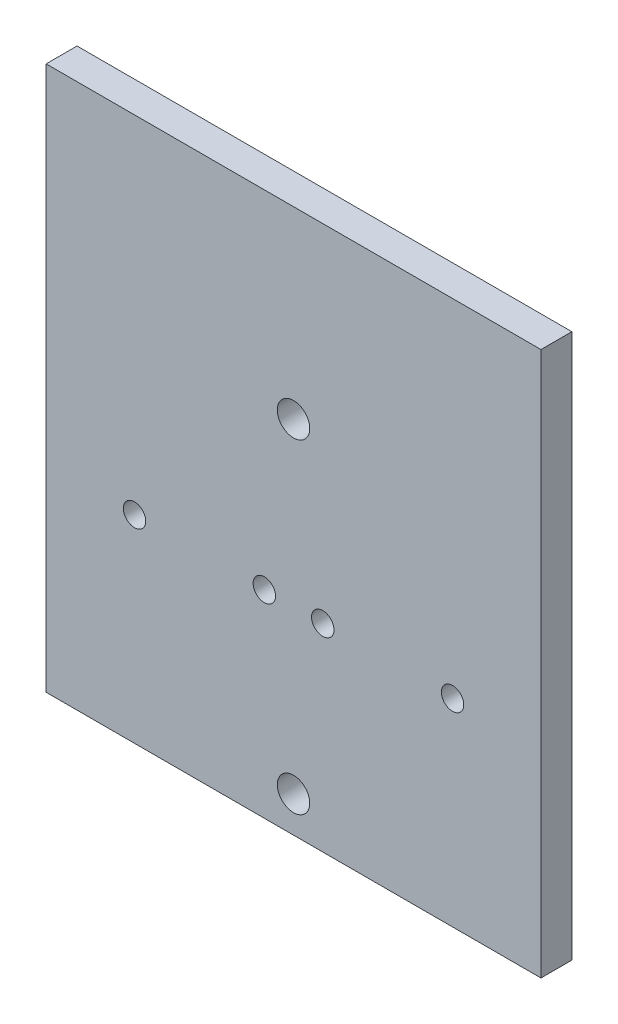
ISO-10303-21;
HEADER;
FILE_DESCRIPTION(('STEP AP214'),'2;1');
FILE_NAME('part.step','',(''),(''),'','','');
FILE_SCHEMA(('AUTOMOTIVE_DESIGN { 1 0 10303 214 1 1 1 1 }'));
ENDSEC;
DATA;
#1=APPLICATION_CONTEXT('core data for automotive mechanical design processes');
#2=APPLICATION_PROTOCOL_DEFINITION('international standard','automotive_design',2000,#1);
#3=PRODUCT_CONTEXT('',#1,'mechanical');
#4=PRODUCT('Part','Part','',(#3));
#5=PRODUCT_RELATED_PRODUCT_CATEGORY('part','',(#4));
#6=PRODUCT_DEFINITION_FORMATION('','',#4);
#7=PRODUCT_DEFINITION_CONTEXT('part definition',#1,'design');
#8=PRODUCT_DEFINITION('design','',#6,#7);
#9=PRODUCT_DEFINITION_SHAPE('','',#8);
#10=(LENGTH_UNIT() NAMED_UNIT(*) SI_UNIT(.MILLI.,.METRE.));
#11=(NAMED_UNIT(*) PLANE_ANGLE_UNIT() SI_UNIT($,.RADIAN.));
#12=(NAMED_UNIT(*) SI_UNIT($,.STERADIAN.) SOLID_ANGLE_UNIT());
#13=UNCERTAINTY_MEASURE_WITH_UNIT(LENGTH_MEASURE(1.E-05),#10,'distance_accuracy_value','');
#14=(GEOMETRIC_REPRESENTATION_CONTEXT(3) GLOBAL_UNCERTAINTY_ASSIGNED_CONTEXT((#13)) GLOBAL_UNIT_ASSIGNED_CONTEXT((#10,
#11,#12)) REPRESENTATION_CONTEXT('',''));
#15=CARTESIAN_POINT('',(0.,0.,0.));
#16=DIRECTION('',(0.,0.,1.));
#17=DIRECTION('',(1.,0.,0.));
#18=AXIS2_PLACEMENT_3D('',#15,#16,#17);
#19=CARTESIAN_POINT('',(0.,-30.5,4.7625));
#20=DIRECTION('',(0.,1.,0.));
#21=DIRECTION('',(0.,0.,1.));
#22=AXIS2_PLACEMENT_3D('',#19,#20,#21);
#23=PLANE('',#22);
#24=DIRECTION('',(1.,0.,0.));
#25=VECTOR('',#24,1.);
#26=CARTESIAN_POINT('',(0.,-30.5,0.));
#27=LINE('',#26,#25);
#28=CARTESIAN_POINT('',(-38.12,-30.5,0.));
#29=VERTEX_POINT('',#28);
#30=CARTESIAN_POINT('',(38.12,-30.5,0.));
#31=VERTEX_POINT('',#30);
#32=EDGE_CURVE('E66',#29,#31,#27,.T.);
#33=ORIENTED_EDGE('',*,*,#32,.T.);
#34=DIRECTION('',(0.,0.,-1.));
#35=VECTOR('',#34,1.);
#36=CARTESIAN_POINT('',(38.12,-30.5,4.7625));
#37=LINE('',#36,#35);
#38=CARTESIAN_POINT('',(38.12,-30.5,4.7625));
#39=VERTEX_POINT('',#38);
#40=EDGE_CURVE('E119',#39,#31,#37,.T.);
#41=ORIENTED_EDGE('',*,*,#40,.F.);
#42=DIRECTION('',(1.,0.,0.));
#43=VECTOR('',#42,1.);
#44=CARTESIAN_POINT('',(0.,-30.5,4.7625));
#45=LINE('',#44,#43);
#46=CARTESIAN_POINT('',(-38.12,-30.5,4.7625));
#47=VERTEX_POINT('',#46);
#48=EDGE_CURVE('E58',#47,#39,#45,.T.);
#49=ORIENTED_EDGE('',*,*,#48,.F.);
#50=DIRECTION('',(0.,0.,1.));
#51=VECTOR('',#50,1.);
#52=CARTESIAN_POINT('',(-38.12,-30.5,0.));
#53=LINE('',#52,#51);
#54=EDGE_CURVE('E90',#29,#47,#53,.T.);
#55=ORIENTED_EDGE('',*,*,#54,.F.);
#56=EDGE_LOOP('',(#33,#41,#49,#55));
#57=FACE_BOUND('',#56,.T.);
#58=ADVANCED_FACE('F41',(#57),#23,.F.);
#59=CARTESIAN_POINT('',(-24.5,0.,4.7625));
#60=DIRECTION('',(0.,0.,-1.));
#61=DIRECTION('',(-1.,0.,0.));
#62=AXIS2_PLACEMENT_3D('',#59,#60,#61);
#63=CYLINDRICAL_SURFACE('',#62,1.7272);
#64=CARTESIAN_POINT('',(-24.5,0.,4.7625));
#65=DIRECTION('',(0.,0.,1.));
#66=DIRECTION('',(1.,0.,0.));
#67=AXIS2_PLACEMENT_3D('',#64,#65,#66);
#68=CIRCLE('',#67,1.7272);
#69=CARTESIAN_POINT('',(-26.2272,0.,4.7625));
#70=VERTEX_POINT('',#69);
#71=EDGE_CURVE('E50',#70,#70,#68,.T.);
#72=CARTESIAN_POINT('',(-24.5,0.,0.));
#73=DIRECTION('',(0.,0.,1.));
#74=DIRECTION('',(1.,0.,0.));
#75=AXIS2_PLACEMENT_3D('',#72,#73,#74);
#76=CIRCLE('',#75,1.7272);
#77=CARTESIAN_POINT('',(-26.2272,0.,0.));
#78=VERTEX_POINT('',#77);
#79=EDGE_CURVE('E169',#78,#78,#76,.T.);
#80=CARTESIAN_POINT('',(-26.2272,0.,4.7625));
#81=CARTESIAN_POINT('',(-26.2272,0.,4.712890625));
#82=CARTESIAN_POINT('',(-26.2272,0.,4.66328125));
#83=CARTESIAN_POINT('',(-26.2272,0.,4.5640625));
#84=CARTESIAN_POINT('',(-26.2272,0.,4.514453125));
#85=CARTESIAN_POINT('',(-26.2272,0.,4.415234375));
#86=CARTESIAN_POINT('',(-26.2272,0.,4.365625));
#87=CARTESIAN_POINT('',(-26.2272,0.,4.26640625));
#88=CARTESIAN_POINT('',(-26.2272,0.,4.216796875));
#89=CARTESIAN_POINT('',(-26.2272,0.,4.117578125));
#90=CARTESIAN_POINT('',(-26.2272,0.,4.06796875));
#91=CARTESIAN_POINT('',(-26.2272,0.,3.96875));
#92=CARTESIAN_POINT('',(-26.2272,0.,3.919140625));
#93=CARTESIAN_POINT('',(-26.2272,0.,3.819921875));
#94=CARTESIAN_POINT('',(-26.2272,0.,3.7703125));
#95=CARTESIAN_POINT('',(-26.2272,0.,3.67109375));
#96=CARTESIAN_POINT('',(-26.2272,0.,3.621484375));
#97=CARTESIAN_POINT('',(-26.2272,0.,3.522265625));
#98=CARTESIAN_POINT('',(-26.2272,0.,3.47265625));
#99=CARTESIAN_POINT('',(-26.2272,0.,3.3734375));
#100=CARTESIAN_POINT('',(-26.2272,0.,3.323828125));
#101=CARTESIAN_POINT('',(-26.2272,0.,3.224609375));
#102=CARTESIAN_POINT('',(-26.2272,0.,3.175));
#103=CARTESIAN_POINT('',(-26.2272,0.,3.07578125));
#104=CARTESIAN_POINT('',(-26.2272,0.,3.026171875));
#105=CARTESIAN_POINT('',(-26.2272,0.,2.926953125));
#106=CARTESIAN_POINT('',(-26.2272,0.,2.87734375));
#107=CARTESIAN_POINT('',(-26.2272,0.,2.778125));
#108=CARTESIAN_POINT('',(-26.2272,0.,2.728515625));
#109=CARTESIAN_POINT('',(-26.2272,0.,2.629296875));
#110=CARTESIAN_POINT('',(-26.2272,0.,2.5796875));
#111=CARTESIAN_POINT('',(-26.2272,0.,2.48046875));
#112=CARTESIAN_POINT('',(-26.2272,0.,2.430859375));
#113=CARTESIAN_POINT('',(-26.2272,0.,2.331640625));
#114=CARTESIAN_POINT('',(-26.2272,0.,2.28203125));
#115=CARTESIAN_POINT('',(-26.2272,0.,2.1828125));
#116=CARTESIAN_POINT('',(-26.2272,0.,2.133203125));
#117=CARTESIAN_POINT('',(-26.2272,0.,2.033984375));
#118=CARTESIAN_POINT('',(-26.2272,0.,1.984375));
#119=CARTESIAN_POINT('',(-26.2272,0.,1.88515625));
#120=CARTESIAN_POINT('',(-26.2272,0.,1.835546875));
#121=CARTESIAN_POINT('',(-26.2272,0.,1.736328125));
#122=CARTESIAN_POINT('',(-26.2272,0.,1.68671875));
#123=CARTESIAN_POINT('',(-26.2272,0.,1.5875));
#124=CARTESIAN_POINT('',(-26.2272,0.,1.537890625));
#125=CARTESIAN_POINT('',(-26.2272,0.,1.438671875));
#126=CARTESIAN_POINT('',(-26.2272,0.,1.3890625));
#127=CARTESIAN_POINT('',(-26.2272,0.,1.28984375));
#128=CARTESIAN_POINT('',(-26.2272,0.,1.240234375));
#129=CARTESIAN_POINT('',(-26.2272,0.,1.141015625));
#130=CARTESIAN_POINT('',(-26.2272,0.,1.09140625));
#131=CARTESIAN_POINT('',(-26.2272,0.,0.992187499999999));
#132=CARTESIAN_POINT('',(-26.2272,0.,0.942578124999999));
#133=CARTESIAN_POINT('',(-26.2272,0.,0.843359375));
#134=CARTESIAN_POINT('',(-26.2272,0.,0.79375));
#135=CARTESIAN_POINT('',(-26.2272,0.,0.69453125));
#136=CARTESIAN_POINT('',(-26.2272,0.,0.644921875));
#137=CARTESIAN_POINT('',(-26.2272,0.,0.545703125));
#138=CARTESIAN_POINT('',(-26.2272,0.,0.49609375));
#139=CARTESIAN_POINT('',(-26.2272,0.,0.396875));
#140=CARTESIAN_POINT('',(-26.2272,0.,0.347265625));
#141=CARTESIAN_POINT('',(-26.2272,0.,0.248046875));
#142=CARTESIAN_POINT('',(-26.2272,0.,0.1984375));
#143=CARTESIAN_POINT('',(-26.2272,0.,0.09921875));
#144=CARTESIAN_POINT('',(-26.2272,0.,0.049609375));
#145=CARTESIAN_POINT('',(-26.2272,0.,0.));
#146=B_SPLINE_CURVE_WITH_KNOTS('',3,(#80,#81,#82,#83,#84,#85,#86,#87,#88,#89,#90,#91,#92,#93,
#94,#95,#96,#97,#98,#99,#100,#101,#102,#103,#104,#105,#106,#107,#108,#109,#110,#111,#112,#113,
#114,#115,#116,#117,#118,#119,#120,#121,#122,#123,#124,#125,#126,#127,#128,#129,#130,#131,#132,
#133,#134,#135,#136,#137,#138,#139,#140,#141,#142,#143,#144,#145),.UNSPECIFIED.,.F.,.F.,(4,2,2,
2,2,2,2,2,2,2,2,2,2,2,2,2,2,2,2,2,2,2,2,2,2,2,2,2,2,2,2,2,4),(0.,0.148828125,0.29765625,
0.446484375,0.5953125,0.744140625,0.892968750000001,1.041796875,1.190625,1.339453125,1.48828125,
1.637109375,1.7859375,1.934765625,2.08359375,2.232421875,2.38125,2.530078125,2.67890625,
2.827734375,2.9765625,3.125390625,3.27421875,3.423046875,3.571875,3.720703125,3.86953125,
4.018359375,4.1671875,4.316015625,4.46484375,4.613671875,4.7625),.UNSPECIFIED.);
#147=EDGE_CURVE('BSEAM195',#70,#78,#146,.T.);
#148=ORIENTED_EDGE('',*,*,#71,.T.);
#149=ORIENTED_EDGE('',*,*,#79,.F.);
#150=ORIENTED_EDGE('',*,*,#147,.T.);
#151=ORIENTED_EDGE('',*,*,#147,.F.);
#152=EDGE_LOOP('',(#148,#150,#149,#151));
#153=FACE_BOUND('',#152,.T.);
#154=ADVANCED_FACE('F195',(#153),#63,.F.);
#155=CARTESIAN_POINT('',(-4.5,0.,4.7625));
#156=DIRECTION('',(0.,0.,-1.));
#157=DIRECTION('',(-1.,0.,0.));
#158=AXIS2_PLACEMENT_3D('',#155,#156,#157);
#159=CYLINDRICAL_SURFACE('',#158,1.7272);
#160=CARTESIAN_POINT('',(-4.5,0.,4.7625));
#161=DIRECTION('',(0.,0.,1.));
#162=DIRECTION('',(1.,0.,0.));
#163=AXIS2_PLACEMENT_3D('',#160,#161,#162);
#164=CIRCLE('',#163,1.7272);
#165=CARTESIAN_POINT('',(-6.2272,0.,4.7625));
#166=VERTEX_POINT('',#165);
#167=EDGE_CURVE('E145',#166,#166,#164,.T.);
#168=CARTESIAN_POINT('',(-4.5,0.,0.));
#169=DIRECTION('',(0.,0.,1.));
#170=DIRECTION('',(1.,0.,0.));
#171=AXIS2_PLACEMENT_3D('',#168,#169,#170);
#172=CIRCLE('',#171,1.7272);
#173=CARTESIAN_POINT('',(-6.2272,0.,0.));
#174=VERTEX_POINT('',#173);
#175=EDGE_CURVE('E166',#174,#174,#172,.T.);
#176=CARTESIAN_POINT('',(-6.2272,0.,4.7625));
#177=CARTESIAN_POINT('',(-6.2272,0.,4.712890625));
#178=CARTESIAN_POINT('',(-6.2272,0.,4.66328125));
#179=CARTESIAN_POINT('',(-6.2272,0.,4.5640625));
#180=CARTESIAN_POINT('',(-6.2272,0.,4.514453125));
#181=CARTESIAN_POINT('',(-6.2272,0.,4.415234375));
#182=CARTESIAN_POINT('',(-6.2272,0.,4.365625));
#183=CARTESIAN_POINT('',(-6.2272,0.,4.26640625));
#184=CARTESIAN_POINT('',(-6.2272,0.,4.216796875));
#185=CARTESIAN_POINT('',(-6.2272,0.,4.117578125));
#186=CARTESIAN_POINT('',(-6.2272,0.,4.06796875));
#187=CARTESIAN_POINT('',(-6.2272,0.,3.96875));
#188=CARTESIAN_POINT('',(-6.2272,0.,3.919140625));
#189=CARTESIAN_POINT('',(-6.2272,0.,3.819921875));
#190=CARTESIAN_POINT('',(-6.2272,0.,3.7703125));
#191=CARTESIAN_POINT('',(-6.2272,0.,3.67109375));
#192=CARTESIAN_POINT('',(-6.2272,0.,3.621484375));
#193=CARTESIAN_POINT('',(-6.2272,0.,3.522265625));
#194=CARTESIAN_POINT('',(-6.2272,0.,3.47265625));
#195=CARTESIAN_POINT('',(-6.2272,0.,3.3734375));
#196=CARTESIAN_POINT('',(-6.2272,0.,3.323828125));
#197=CARTESIAN_POINT('',(-6.2272,0.,3.224609375));
#198=CARTESIAN_POINT('',(-6.2272,0.,3.175));
#199=CARTESIAN_POINT('',(-6.2272,0.,3.07578125));
#200=CARTESIAN_POINT('',(-6.2272,0.,3.026171875));
#201=CARTESIAN_POINT('',(-6.2272,0.,2.926953125));
#202=CARTESIAN_POINT('',(-6.2272,0.,2.87734375));
#203=CARTESIAN_POINT('',(-6.2272,0.,2.778125));
#204=CARTESIAN_POINT('',(-6.2272,0.,2.728515625));
#205=CARTESIAN_POINT('',(-6.2272,0.,2.629296875));
#206=CARTESIAN_POINT('',(-6.2272,0.,2.5796875));
#207=CARTESIAN_POINT('',(-6.2272,0.,2.48046875));
#208=CARTESIAN_POINT('',(-6.2272,0.,2.430859375));
#209=CARTESIAN_POINT('',(-6.2272,0.,2.331640625));
#210=CARTESIAN_POINT('',(-6.2272,0.,2.28203125));
#211=CARTESIAN_POINT('',(-6.2272,0.,2.1828125));
#212=CARTESIAN_POINT('',(-6.2272,0.,2.133203125));
#213=CARTESIAN_POINT('',(-6.2272,0.,2.033984375));
#214=CARTESIAN_POINT('',(-6.2272,0.,1.984375));
#215=CARTESIAN_POINT('',(-6.2272,0.,1.88515625));
#216=CARTESIAN_POINT('',(-6.2272,0.,1.835546875));
#217=CARTESIAN_POINT('',(-6.2272,0.,1.736328125));
#218=CARTESIAN_POINT('',(-6.2272,0.,1.68671875));
#219=CARTESIAN_POINT('',(-6.2272,0.,1.5875));
#220=CARTESIAN_POINT('',(-6.2272,0.,1.537890625));
#221=CARTESIAN_POINT('',(-6.2272,0.,1.438671875));
#222=CARTESIAN_POINT('',(-6.2272,0.,1.3890625));
#223=CARTESIAN_POINT('',(-6.2272,0.,1.28984375));
#224=CARTESIAN_POINT('',(-6.2272,0.,1.240234375));
#225=CARTESIAN_POINT('',(-6.2272,0.,1.141015625));
#226=CARTESIAN_POINT('',(-6.2272,0.,1.09140625));
#227=CARTESIAN_POINT('',(-6.2272,0.,0.992187499999999));
#228=CARTESIAN_POINT('',(-6.2272,0.,0.942578124999999));
#229=CARTESIAN_POINT('',(-6.2272,0.,0.843359375));
#230=CARTESIAN_POINT('',(-6.2272,0.,0.79375));
#231=CARTESIAN_POINT('',(-6.2272,0.,0.69453125));
#232=CARTESIAN_POINT('',(-6.2272,0.,0.644921875));
#233=CARTESIAN_POINT('',(-6.2272,0.,0.545703125));
#234=CARTESIAN_POINT('',(-6.2272,0.,0.49609375));
#235=CARTESIAN_POINT('',(-6.2272,0.,0.396875));
#236=CARTESIAN_POINT('',(-6.2272,0.,0.347265625));
#237=CARTESIAN_POINT('',(-6.2272,0.,0.248046875));
#238=CARTESIAN_POINT('',(-6.2272,0.,0.1984375));
#239=CARTESIAN_POINT('',(-6.2272,0.,0.09921875));
#240=CARTESIAN_POINT('',(-6.2272,0.,0.049609375));
#241=CARTESIAN_POINT('',(-6.2272,0.,0.));
#242=B_SPLINE_CURVE_WITH_KNOTS('',3,(#176,#177,#178,#179,#180,#181,#182,#183,#184,#185,#186,
#187,#188,#189,#190,#191,#192,#193,#194,#195,#196,#197,#198,#199,#200,#201,#202,#203,#204,#205,
#206,#207,#208,#209,#210,#211,#212,#213,#214,#215,#216,#217,#218,#219,#220,#221,#222,#223,#224,
#225,#226,#227,#228,#229,#230,#231,#232,#233,#234,#235,#236,#237,#238,#239,#240,#241),
.UNSPECIFIED.,.F.,.F.,(4,2,2,2,2,2,2,2,2,2,2,2,2,2,2,2,2,2,2,2,2,2,2,2,2,2,2,2,2,2,2,2,4),(0.,
0.148828125,0.29765625,0.446484375,0.5953125,0.744140625,0.892968750000001,1.041796875,1.190625,
1.339453125,1.48828125,1.637109375,1.7859375,1.934765625,2.08359375,2.232421875,2.38125,
2.530078125,2.67890625,2.827734375,2.9765625,3.125390625,3.27421875,3.423046875,3.571875,
3.720703125,3.86953125,4.018359375,4.1671875,4.316015625,4.46484375,4.613671875,4.7625),.UNSPECIFIED.);
#243=EDGE_CURVE('BSEAM199',#166,#174,#242,.T.);
#244=ORIENTED_EDGE('',*,*,#167,.T.);
#245=ORIENTED_EDGE('',*,*,#175,.F.);
#246=ORIENTED_EDGE('',*,*,#243,.T.);
#247=ORIENTED_EDGE('',*,*,#243,.F.);
#248=EDGE_LOOP('',(#244,#246,#245,#247));
#249=FACE_BOUND('',#248,.T.);
#250=ADVANCED_FACE('F199',(#249),#159,.F.);
#251=CARTESIAN_POINT('',(4.5,0.,4.7625));
#252=DIRECTION('',(0.,0.,-1.));
#253=DIRECTION('',(-1.,0.,0.));
#254=AXIS2_PLACEMENT_3D('',#251,#252,#253);
#255=CYLINDRICAL_SURFACE('',#254,1.7272);
#256=CARTESIAN_POINT('',(4.5,0.,4.7625));
#257=DIRECTION('',(0.,0.,1.));
#258=DIRECTION('',(1.,0.,0.));
#259=AXIS2_PLACEMENT_3D('',#256,#257,#258);
#260=CIRCLE('',#259,1.7272);
#261=CARTESIAN_POINT('',(2.7728,0.,4.7625));
#262=VERTEX_POINT('',#261);
#263=EDGE_CURVE('E141',#262,#262,#260,.T.);
#264=CARTESIAN_POINT('',(4.5,0.,0.));
#265=DIRECTION('',(0.,0.,1.));
#266=DIRECTION('',(1.,0.,0.));
#267=AXIS2_PLACEMENT_3D('',#264,#265,#266);
#268=CIRCLE('',#267,1.7272);
#269=CARTESIAN_POINT('',(2.7728,0.,0.));
#270=VERTEX_POINT('',#269);
#271=EDGE_CURVE('E162',#270,#270,#268,.T.);
#272=CARTESIAN_POINT('',(2.7728,0.,4.7625));
#273=CARTESIAN_POINT('',(2.7728,0.,4.712890625));
#274=CARTESIAN_POINT('',(2.7728,0.,4.66328125));
#275=CARTESIAN_POINT('',(2.7728,0.,4.5640625));
#276=CARTESIAN_POINT('',(2.7728,0.,4.514453125));
#277=CARTESIAN_POINT('',(2.7728,0.,4.415234375));
#278=CARTESIAN_POINT('',(2.7728,0.,4.365625));
#279=CARTESIAN_POINT('',(2.7728,0.,4.26640625));
#280=CARTESIAN_POINT('',(2.7728,0.,4.216796875));
#281=CARTESIAN_POINT('',(2.7728,0.,4.117578125));
#282=CARTESIAN_POINT('',(2.7728,0.,4.06796875));
#283=CARTESIAN_POINT('',(2.7728,0.,3.96875));
#284=CARTESIAN_POINT('',(2.7728,0.,3.919140625));
#285=CARTESIAN_POINT('',(2.7728,0.,3.819921875));
#286=CARTESIAN_POINT('',(2.7728,0.,3.7703125));
#287=CARTESIAN_POINT('',(2.7728,0.,3.67109375));
#288=CARTESIAN_POINT('',(2.7728,0.,3.621484375));
#289=CARTESIAN_POINT('',(2.7728,0.,3.522265625));
#290=CARTESIAN_POINT('',(2.7728,0.,3.47265625));
#291=CARTESIAN_POINT('',(2.7728,0.,3.3734375));
#292=CARTESIAN_POINT('',(2.7728,0.,3.323828125));
#293=CARTESIAN_POINT('',(2.7728,0.,3.224609375));
#294=CARTESIAN_POINT('',(2.7728,0.,3.175));
#295=CARTESIAN_POINT('',(2.7728,0.,3.07578125));
#296=CARTESIAN_POINT('',(2.7728,0.,3.026171875));
#297=CARTESIAN_POINT('',(2.7728,0.,2.926953125));
#298=CARTESIAN_POINT('',(2.7728,0.,2.87734375));
#299=CARTESIAN_POINT('',(2.7728,0.,2.778125));
#300=CARTESIAN_POINT('',(2.7728,0.,2.728515625));
#301=CARTESIAN_POINT('',(2.7728,0.,2.629296875));
#302=CARTESIAN_POINT('',(2.7728,0.,2.5796875));
#303=CARTESIAN_POINT('',(2.7728,0.,2.48046875));
#304=CARTESIAN_POINT('',(2.7728,0.,2.430859375));
#305=CARTESIAN_POINT('',(2.7728,0.,2.331640625));
#306=CARTESIAN_POINT('',(2.7728,0.,2.28203125));
#307=CARTESIAN_POINT('',(2.7728,0.,2.1828125));
#308=CARTESIAN_POINT('',(2.7728,0.,2.133203125));
#309=CARTESIAN_POINT('',(2.7728,0.,2.033984375));
#310=CARTESIAN_POINT('',(2.7728,0.,1.984375));
#311=CARTESIAN_POINT('',(2.7728,0.,1.88515625));
#312=CARTESIAN_POINT('',(2.7728,0.,1.835546875));
#313=CARTESIAN_POINT('',(2.7728,0.,1.736328125));
#314=CARTESIAN_POINT('',(2.7728,0.,1.68671875));
#315=CARTESIAN_POINT('',(2.7728,0.,1.5875));
#316=CARTESIAN_POINT('',(2.7728,0.,1.537890625));
#317=CARTESIAN_POINT('',(2.7728,0.,1.438671875));
#318=CARTESIAN_POINT('',(2.7728,0.,1.3890625));
#319=CARTESIAN_POINT('',(2.7728,0.,1.28984375));
#320=CARTESIAN_POINT('',(2.7728,0.,1.240234375));
#321=CARTESIAN_POINT('',(2.7728,0.,1.141015625));
#322=CARTESIAN_POINT('',(2.7728,0.,1.09140625));
#323=CARTESIAN_POINT('',(2.7728,0.,0.992187499999999));
#324=CARTESIAN_POINT('',(2.7728,0.,0.942578124999999));
#325=CARTESIAN_POINT('',(2.7728,0.,0.843359375));
#326=CARTESIAN_POINT('',(2.7728,0.,0.79375));
#327=CARTESIAN_POINT('',(2.7728,0.,0.69453125));
#328=CARTESIAN_POINT('',(2.7728,0.,0.644921875));
#329=CARTESIAN_POINT('',(2.7728,0.,0.545703125));
#330=CARTESIAN_POINT('',(2.7728,0.,0.49609375));
#331=CARTESIAN_POINT('',(2.7728,0.,0.396875));
#332=CARTESIAN_POINT('',(2.7728,0.,0.347265625));
#333=CARTESIAN_POINT('',(2.7728,0.,0.248046875));
#334=CARTESIAN_POINT('',(2.7728,0.,0.1984375));
#335=CARTESIAN_POINT('',(2.7728,0.,0.09921875));
#336=CARTESIAN_POINT('',(2.7728,0.,0.049609375));
#337=CARTESIAN_POINT('',(2.7728,0.,0.));
#338=B_SPLINE_CURVE_WITH_KNOTS('',3,(#272,#273,#274,#275,#276,#277,#278,#279,#280,#281,#282,
#283,#284,#285,#286,#287,#288,#289,#290,#291,#292,#293,#294,#295,#296,#297,#298,#299,#300,#301,
#302,#303,#304,#305,#306,#307,#308,#309,#310,#311,#312,#313,#314,#315,#316,#317,#318,#319,#320,
#321,#322,#323,#324,#325,#326,#327,#328,#329,#330,#331,#332,#333,#334,#335,#336,#337),
.UNSPECIFIED.,.F.,.F.,(4,2,2,2,2,2,2,2,2,2,2,2,2,2,2,2,2,2,2,2,2,2,2,2,2,2,2,2,2,2,2,2,4),(0.,
0.148828125,0.29765625,0.446484375,0.5953125,0.744140625,0.892968750000001,1.041796875,1.190625,
1.339453125,1.48828125,1.637109375,1.7859375,1.934765625,2.08359375,2.232421875,2.38125,
2.530078125,2.67890625,2.827734375,2.9765625,3.125390625,3.27421875,3.423046875,3.571875,
3.720703125,3.86953125,4.018359375,4.1671875,4.316015625,4.46484375,4.613671875,4.7625),.UNSPECIFIED.);
#339=EDGE_CURVE('BSEAM214',#262,#270,#338,.T.);
#340=ORIENTED_EDGE('',*,*,#263,.T.);
#341=ORIENTED_EDGE('',*,*,#271,.F.);
#342=ORIENTED_EDGE('',*,*,#339,.T.);
#343=ORIENTED_EDGE('',*,*,#339,.F.);
#344=EDGE_LOOP('',(#340,#342,#341,#343));
#345=FACE_BOUND('',#344,.T.);
#346=ADVANCED_FACE('F214',(#345),#255,.F.);
#347=CARTESIAN_POINT('',(24.5,0.,4.7625));
#348=DIRECTION('',(0.,0.,-1.));
#349=DIRECTION('',(-1.,0.,0.));
#350=AXIS2_PLACEMENT_3D('',#347,#348,#349);
#351=CYLINDRICAL_SURFACE('',#350,1.7272);
#352=CARTESIAN_POINT('',(24.5,0.,4.7625));
#353=DIRECTION('',(0.,0.,1.));
#354=DIRECTION('',(1.,0.,0.));
#355=AXIS2_PLACEMENT_3D('',#352,#353,#354);
#356=CIRCLE('',#355,1.7272);
#357=CARTESIAN_POINT('',(22.7728,0.,4.7625));
#358=VERTEX_POINT('',#357);
#359=EDGE_CURVE('E137',#358,#358,#356,.T.);
#360=CARTESIAN_POINT('',(24.5,0.,0.));
#361=DIRECTION('',(0.,0.,1.));
#362=DIRECTION('',(1.,0.,0.));
#363=AXIS2_PLACEMENT_3D('',#360,#361,#362);
#364=CIRCLE('',#363,1.7272);
#365=CARTESIAN_POINT('',(22.7728,0.,0.));
#366=VERTEX_POINT('',#365);
#367=EDGE_CURVE('E158',#366,#366,#364,.T.);
#368=CARTESIAN_POINT('',(22.7728,0.,4.7625));
#369=CARTESIAN_POINT('',(22.7728,0.,4.712890625));
#370=CARTESIAN_POINT('',(22.7728,0.,4.66328125));
#371=CARTESIAN_POINT('',(22.7728,0.,4.5640625));
#372=CARTESIAN_POINT('',(22.7728,0.,4.514453125));
#373=CARTESIAN_POINT('',(22.7728,0.,4.415234375));
#374=CARTESIAN_POINT('',(22.7728,0.,4.365625));
#375=CARTESIAN_POINT('',(22.7728,0.,4.26640625));
#376=CARTESIAN_POINT('',(22.7728,0.,4.216796875));
#377=CARTESIAN_POINT('',(22.7728,0.,4.117578125));
#378=CARTESIAN_POINT('',(22.7728,0.,4.06796875));
#379=CARTESIAN_POINT('',(22.7728,0.,3.96875));
#380=CARTESIAN_POINT('',(22.7728,0.,3.919140625));
#381=CARTESIAN_POINT('',(22.7728,0.,3.819921875));
#382=CARTESIAN_POINT('',(22.7728,0.,3.7703125));
#383=CARTESIAN_POINT('',(22.7728,0.,3.67109375));
#384=CARTESIAN_POINT('',(22.7728,0.,3.621484375));
#385=CARTESIAN_POINT('',(22.7728,0.,3.522265625));
#386=CARTESIAN_POINT('',(22.7728,0.,3.47265625));
#387=CARTESIAN_POINT('',(22.7728,0.,3.3734375));
#388=CARTESIAN_POINT('',(22.7728,0.,3.323828125));
#389=CARTESIAN_POINT('',(22.7728,0.,3.224609375));
#390=CARTESIAN_POINT('',(22.7728,0.,3.175));
#391=CARTESIAN_POINT('',(22.7728,0.,3.07578125));
#392=CARTESIAN_POINT('',(22.7728,0.,3.026171875));
#393=CARTESIAN_POINT('',(22.7728,0.,2.926953125));
#394=CARTESIAN_POINT('',(22.7728,0.,2.87734375));
#395=CARTESIAN_POINT('',(22.7728,0.,2.778125));
#396=CARTESIAN_POINT('',(22.7728,0.,2.728515625));
#397=CARTESIAN_POINT('',(22.7728,0.,2.629296875));
#398=CARTESIAN_POINT('',(22.7728,0.,2.5796875));
#399=CARTESIAN_POINT('',(22.7728,0.,2.48046875));
#400=CARTESIAN_POINT('',(22.7728,0.,2.430859375));
#401=CARTESIAN_POINT('',(22.7728,0.,2.331640625));
#402=CARTESIAN_POINT('',(22.7728,0.,2.28203125));
#403=CARTESIAN_POINT('',(22.7728,0.,2.1828125));
#404=CARTESIAN_POINT('',(22.7728,0.,2.133203125));
#405=CARTESIAN_POINT('',(22.7728,0.,2.033984375));
#406=CARTESIAN_POINT('',(22.7728,0.,1.984375));
#407=CARTESIAN_POINT('',(22.7728,0.,1.88515625));
#408=CARTESIAN_POINT('',(22.7728,0.,1.835546875));
#409=CARTESIAN_POINT('',(22.7728,0.,1.736328125));
#410=CARTESIAN_POINT('',(22.7728,0.,1.68671875));
#411=CARTESIAN_POINT('',(22.7728,0.,1.5875));
#412=CARTESIAN_POINT('',(22.7728,0.,1.537890625));
#413=CARTESIAN_POINT('',(22.7728,0.,1.438671875));
#414=CARTESIAN_POINT('',(22.7728,0.,1.3890625));
#415=CARTESIAN_POINT('',(22.7728,0.,1.28984375));
#416=CARTESIAN_POINT('',(22.7728,0.,1.240234375));
#417=CARTESIAN_POINT('',(22.7728,0.,1.141015625));
#418=CARTESIAN_POINT('',(22.7728,0.,1.09140625));
#419=CARTESIAN_POINT('',(22.7728,0.,0.992187499999999));
#420=CARTESIAN_POINT('',(22.7728,0.,0.942578124999999));
#421=CARTESIAN_POINT('',(22.7728,0.,0.843359375));
#422=CARTESIAN_POINT('',(22.7728,0.,0.79375));
#423=CARTESIAN_POINT('',(22.7728,0.,0.69453125));
#424=CARTESIAN_POINT('',(22.7728,0.,0.644921875));
#425=CARTESIAN_POINT('',(22.7728,0.,0.545703125));
#426=CARTESIAN_POINT('',(22.7728,0.,0.49609375));
#427=CARTESIAN_POINT('',(22.7728,0.,0.396875));
#428=CARTESIAN_POINT('',(22.7728,0.,0.347265625));
#429=CARTESIAN_POINT('',(22.7728,0.,0.248046875));
#430=CARTESIAN_POINT('',(22.7728,0.,0.1984375));
#431=CARTESIAN_POINT('',(22.7728,0.,0.09921875));
#432=CARTESIAN_POINT('',(22.7728,0.,0.049609375));
#433=CARTESIAN_POINT('',(22.7728,0.,0.));
#434=B_SPLINE_CURVE_WITH_KNOTS('',3,(#368,#369,#370,#371,#372,#373,#374,#375,#376,#377,#378,
#379,#380,#381,#382,#383,#384,#385,#386,#387,#388,#389,#390,#391,#392,#393,#394,#395,#396,#397,
#398,#399,#400,#401,#402,#403,#404,#405,#406,#407,#408,#409,#410,#411,#412,#413,#414,#415,#416,
#417,#418,#419,#420,#421,#422,#423,#424,#425,#426,#427,#428,#429,#430,#431,#432,#433),
.UNSPECIFIED.,.F.,.F.,(4,2,2,2,2,2,2,2,2,2,2,2,2,2,2,2,2,2,2,2,2,2,2,2,2,2,2,2,2,2,2,2,4),(0.,
0.148828125,0.29765625,0.446484375,0.5953125,0.744140625,0.892968750000001,1.041796875,1.190625,
1.339453125,1.48828125,1.637109375,1.7859375,1.934765625,2.08359375,2.232421875,2.38125,
2.530078125,2.67890625,2.827734375,2.9765625,3.125390625,3.27421875,3.423046875,3.571875,
3.720703125,3.86953125,4.018359375,4.1671875,4.316015625,4.46484375,4.613671875,4.7625),.UNSPECIFIED.);
#435=EDGE_CURVE('BSEAM190',#358,#366,#434,.T.);
#436=ORIENTED_EDGE('',*,*,#359,.T.);
#437=ORIENTED_EDGE('',*,*,#367,.F.);
#438=ORIENTED_EDGE('',*,*,#435,.T.);
#439=ORIENTED_EDGE('',*,*,#435,.F.);
#440=EDGE_LOOP('',(#436,#438,#437,#439));
#441=FACE_BOUND('',#440,.T.);
#442=ADVANCED_FACE('F190',(#441),#351,.F.);
#443=CARTESIAN_POINT('',(0.,-25.,4.7625));
#444=DIRECTION('',(0.,0.,-1.));
#445=DIRECTION('',(-1.,0.,0.));
#446=AXIS2_PLACEMENT_3D('',#443,#444,#445);
#447=CYLINDRICAL_SURFACE('',#446,2.5);
#448=CARTESIAN_POINT('',(0.,-25.,4.7625));
#449=DIRECTION('',(0.,0.,1.));
#450=DIRECTION('',(1.,0.,0.));
#451=AXIS2_PLACEMENT_3D('',#448,#449,#450);
#452=CIRCLE('',#451,2.5);
#453=CARTESIAN_POINT('',(-2.5,-25.,4.7625));
#454=VERTEX_POINT('',#453);
#455=EDGE_CURVE('E133',#454,#454,#452,.T.);
#456=CARTESIAN_POINT('',(0.,-25.,0.));
#457=DIRECTION('',(0.,0.,1.));
#458=DIRECTION('',(1.,0.,0.));
#459=AXIS2_PLACEMENT_3D('',#456,#457,#458);
#460=CIRCLE('',#459,2.5);
#461=CARTESIAN_POINT('',(-2.5,-25.,0.));
#462=VERTEX_POINT('',#461);
#463=EDGE_CURVE('E154',#462,#462,#460,.T.);
#464=CARTESIAN_POINT('',(-2.5,-25.,4.7625));
#465=CARTESIAN_POINT('',(-2.5,-25.,4.712890625));
#466=CARTESIAN_POINT('',(-2.5,-25.,4.66328125));
#467=CARTESIAN_POINT('',(-2.5,-25.,4.5640625));
#468=CARTESIAN_POINT('',(-2.5,-25.,4.514453125));
#469=CARTESIAN_POINT('',(-2.5,-25.,4.415234375));
#470=CARTESIAN_POINT('',(-2.5,-25.,4.365625));
#471=CARTESIAN_POINT('',(-2.5,-25.,4.26640625));
#472=CARTESIAN_POINT('',(-2.5,-25.,4.216796875));
#473=CARTESIAN_POINT('',(-2.5,-25.,4.117578125));
#474=CARTESIAN_POINT('',(-2.5,-25.,4.06796875));
#475=CARTESIAN_POINT('',(-2.5,-25.,3.96875));
#476=CARTESIAN_POINT('',(-2.5,-25.,3.919140625));
#477=CARTESIAN_POINT('',(-2.5,-25.,3.819921875));
#478=CARTESIAN_POINT('',(-2.5,-25.,3.7703125));
#479=CARTESIAN_POINT('',(-2.5,-25.,3.67109375));
#480=CARTESIAN_POINT('',(-2.5,-25.,3.621484375));
#481=CARTESIAN_POINT('',(-2.5,-25.,3.522265625));
#482=CARTESIAN_POINT('',(-2.5,-25.,3.47265625));
#483=CARTESIAN_POINT('',(-2.5,-25.,3.3734375));
#484=CARTESIAN_POINT('',(-2.5,-25.,3.323828125));
#485=CARTESIAN_POINT('',(-2.5,-25.,3.224609375));
#486=CARTESIAN_POINT('',(-2.5,-25.,3.175));
#487=CARTESIAN_POINT('',(-2.5,-25.,3.07578125));
#488=CARTESIAN_POINT('',(-2.5,-25.,3.026171875));
#489=CARTESIAN_POINT('',(-2.5,-25.,2.926953125));
#490=CARTESIAN_POINT('',(-2.5,-25.,2.87734375));
#491=CARTESIAN_POINT('',(-2.5,-25.,2.778125));
#492=CARTESIAN_POINT('',(-2.5,-25.,2.728515625));
#493=CARTESIAN_POINT('',(-2.5,-25.,2.629296875));
#494=CARTESIAN_POINT('',(-2.5,-25.,2.5796875));
#495=CARTESIAN_POINT('',(-2.5,-25.,2.48046875));
#496=CARTESIAN_POINT('',(-2.5,-25.,2.430859375));
#497=CARTESIAN_POINT('',(-2.5,-25.,2.331640625));
#498=CARTESIAN_POINT('',(-2.5,-25.,2.28203125));
#499=CARTESIAN_POINT('',(-2.5,-25.,2.1828125));
#500=CARTESIAN_POINT('',(-2.5,-25.,2.133203125));
#501=CARTESIAN_POINT('',(-2.5,-25.,2.033984375));
#502=CARTESIAN_POINT('',(-2.5,-25.,1.984375));
#503=CARTESIAN_POINT('',(-2.5,-25.,1.88515625));
#504=CARTESIAN_POINT('',(-2.5,-25.,1.835546875));
#505=CARTESIAN_POINT('',(-2.5,-25.,1.736328125));
#506=CARTESIAN_POINT('',(-2.5,-25.,1.68671875));
#507=CARTESIAN_POINT('',(-2.5,-25.,1.5875));
#508=CARTESIAN_POINT('',(-2.5,-25.,1.537890625));
#509=CARTESIAN_POINT('',(-2.5,-25.,1.438671875));
#510=CARTESIAN_POINT('',(-2.5,-25.,1.3890625));
#511=CARTESIAN_POINT('',(-2.5,-25.,1.28984375));
#512=CARTESIAN_POINT('',(-2.5,-25.,1.240234375));
#513=CARTESIAN_POINT('',(-2.5,-25.,1.141015625));
#514=CARTESIAN_POINT('',(-2.5,-25.,1.09140625));
#515=CARTESIAN_POINT('',(-2.5,-25.,0.992187499999999));
#516=CARTESIAN_POINT('',(-2.5,-25.,0.942578124999999));
#517=CARTESIAN_POINT('',(-2.5,-25.,0.843359375));
#518=CARTESIAN_POINT('',(-2.5,-25.,0.79375));
#519=CARTESIAN_POINT('',(-2.5,-25.,0.69453125));
#520=CARTESIAN_POINT('',(-2.5,-25.,0.644921875));
#521=CARTESIAN_POINT('',(-2.5,-25.,0.545703125));
#522=CARTESIAN_POINT('',(-2.5,-25.,0.49609375));
#523=CARTESIAN_POINT('',(-2.5,-25.,0.396875));
#524=CARTESIAN_POINT('',(-2.5,-25.,0.347265625));
#525=CARTESIAN_POINT('',(-2.5,-25.,0.248046875));
#526=CARTESIAN_POINT('',(-2.5,-25.,0.1984375));
#527=CARTESIAN_POINT('',(-2.5,-25.,0.09921875));
#528=CARTESIAN_POINT('',(-2.5,-25.,0.049609375));
#529=CARTESIAN_POINT('',(-2.5,-25.,0.));
#530=B_SPLINE_CURVE_WITH_KNOTS('',3,(#464,#465,#466,#467,#468,#469,#470,#471,#472,#473,#474,
#475,#476,#477,#478,#479,#480,#481,#482,#483,#484,#485,#486,#487,#488,#489,#490,#491,#492,#493,
#494,#495,#496,#497,#498,#499,#500,#501,#502,#503,#504,#505,#506,#507,#508,#509,#510,#511,#512,
#513,#514,#515,#516,#517,#518,#519,#520,#521,#522,#523,#524,#525,#526,#527,#528,#529),
.UNSPECIFIED.,.F.,.F.,(4,2,2,2,2,2,2,2,2,2,2,2,2,2,2,2,2,2,2,2,2,2,2,2,2,2,2,2,2,2,2,2,4),(0.,
0.148828125,0.29765625,0.446484375,0.5953125,0.744140625,0.892968750000001,1.041796875,1.190625,
1.339453125,1.48828125,1.637109375,1.7859375,1.934765625,2.08359375,2.232421875,2.38125,
2.530078125,2.67890625,2.827734375,2.9765625,3.125390625,3.27421875,3.423046875,3.571875,
3.720703125,3.86953125,4.018359375,4.1671875,4.316015625,4.46484375,4.613671875,4.7625),.UNSPECIFIED.);
#531=EDGE_CURVE('BSEAM182',#454,#462,#530,.T.);
#532=ORIENTED_EDGE('',*,*,#455,.T.);
#533=ORIENTED_EDGE('',*,*,#463,.F.);
#534=ORIENTED_EDGE('',*,*,#531,.T.);
#535=ORIENTED_EDGE('',*,*,#531,.F.);
#536=EDGE_LOOP('',(#532,#534,#533,#535));
#537=FACE_BOUND('',#536,.T.);
#538=ADVANCED_FACE('F182',(#537),#447,.F.);
#539=CARTESIAN_POINT('',(0.,25.,4.7625));
#540=DIRECTION('',(0.,0.,-1.));
#541=DIRECTION('',(-1.,0.,0.));
#542=AXIS2_PLACEMENT_3D('',#539,#540,#541);
#543=CYLINDRICAL_SURFACE('',#542,2.5);
#544=CARTESIAN_POINT('',(0.,25.,4.7625));
#545=DIRECTION('',(0.,0.,1.));
#546=DIRECTION('',(1.,0.,0.));
#547=AXIS2_PLACEMENT_3D('',#544,#545,#546);
#548=CIRCLE('',#547,2.5);
#549=CARTESIAN_POINT('',(-2.5,25.,4.7625));
#550=VERTEX_POINT('',#549);
#551=EDGE_CURVE('E11',#550,#550,#548,.T.);
#552=CARTESIAN_POINT('',(0.,25.,0.));
#553=DIRECTION('',(0.,0.,1.));
#554=DIRECTION('',(1.,0.,0.));
#555=AXIS2_PLACEMENT_3D('',#552,#553,#554);
#556=CIRCLE('',#555,2.5);
#557=CARTESIAN_POINT('',(-2.5,25.,0.));
#558=VERTEX_POINT('',#557);
#559=EDGE_CURVE('E44',#558,#558,#556,.T.);
#560=CARTESIAN_POINT('',(-2.5,25.,4.7625));
#561=CARTESIAN_POINT('',(-2.5,25.,4.712890625));
#562=CARTESIAN_POINT('',(-2.5,25.,4.66328125));
#563=CARTESIAN_POINT('',(-2.5,25.,4.5640625));
#564=CARTESIAN_POINT('',(-2.5,25.,4.514453125));
#565=CARTESIAN_POINT('',(-2.5,25.,4.415234375));
#566=CARTESIAN_POINT('',(-2.5,25.,4.365625));
#567=CARTESIAN_POINT('',(-2.5,25.,4.26640625));
#568=CARTESIAN_POINT('',(-2.5,25.,4.216796875));
#569=CARTESIAN_POINT('',(-2.5,25.,4.117578125));
#570=CARTESIAN_POINT('',(-2.5,25.,4.06796875));
#571=CARTESIAN_POINT('',(-2.5,25.,3.96875));
#572=CARTESIAN_POINT('',(-2.5,25.,3.919140625));
#573=CARTESIAN_POINT('',(-2.5,25.,3.819921875));
#574=CARTESIAN_POINT('',(-2.5,25.,3.7703125));
#575=CARTESIAN_POINT('',(-2.5,25.,3.67109375));
#576=CARTESIAN_POINT('',(-2.5,25.,3.621484375));
#577=CARTESIAN_POINT('',(-2.5,25.,3.522265625));
#578=CARTESIAN_POINT('',(-2.5,25.,3.47265625));
#579=CARTESIAN_POINT('',(-2.5,25.,3.3734375));
#580=CARTESIAN_POINT('',(-2.5,25.,3.323828125));
#581=CARTESIAN_POINT('',(-2.5,25.,3.224609375));
#582=CARTESIAN_POINT('',(-2.5,25.,3.175));
#583=CARTESIAN_POINT('',(-2.5,25.,3.07578125));
#584=CARTESIAN_POINT('',(-2.5,25.,3.026171875));
#585=CARTESIAN_POINT('',(-2.5,25.,2.926953125));
#586=CARTESIAN_POINT('',(-2.5,25.,2.87734375));
#587=CARTESIAN_POINT('',(-2.5,25.,2.778125));
#588=CARTESIAN_POINT('',(-2.5,25.,2.728515625));
#589=CARTESIAN_POINT('',(-2.5,25.,2.629296875));
#590=CARTESIAN_POINT('',(-2.5,25.,2.5796875));
#591=CARTESIAN_POINT('',(-2.5,25.,2.48046875));
#592=CARTESIAN_POINT('',(-2.5,25.,2.430859375));
#593=CARTESIAN_POINT('',(-2.5,25.,2.331640625));
#594=CARTESIAN_POINT('',(-2.5,25.,2.28203125));
#595=CARTESIAN_POINT('',(-2.5,25.,2.1828125));
#596=CARTESIAN_POINT('',(-2.5,25.,2.133203125));
#597=CARTESIAN_POINT('',(-2.5,25.,2.033984375));
#598=CARTESIAN_POINT('',(-2.5,25.,1.984375));
#599=CARTESIAN_POINT('',(-2.5,25.,1.88515625));
#600=CARTESIAN_POINT('',(-2.5,25.,1.835546875));
#601=CARTESIAN_POINT('',(-2.5,25.,1.736328125));
#602=CARTESIAN_POINT('',(-2.5,25.,1.68671875));
#603=CARTESIAN_POINT('',(-2.5,25.,1.5875));
#604=CARTESIAN_POINT('',(-2.5,25.,1.537890625));
#605=CARTESIAN_POINT('',(-2.5,25.,1.438671875));
#606=CARTESIAN_POINT('',(-2.5,25.,1.3890625));
#607=CARTESIAN_POINT('',(-2.5,25.,1.28984375));
#608=CARTESIAN_POINT('',(-2.5,25.,1.240234375));
#609=CARTESIAN_POINT('',(-2.5,25.,1.141015625));
#610=CARTESIAN_POINT('',(-2.5,25.,1.09140625));
#611=CARTESIAN_POINT('',(-2.5,25.,0.992187499999999));
#612=CARTESIAN_POINT('',(-2.5,25.,0.942578124999999));
#613=CARTESIAN_POINT('',(-2.5,25.,0.843359375));
#614=CARTESIAN_POINT('',(-2.5,25.,0.79375));
#615=CARTESIAN_POINT('',(-2.5,25.,0.69453125));
#616=CARTESIAN_POINT('',(-2.5,25.,0.644921875));
#617=CARTESIAN_POINT('',(-2.5,25.,0.545703125));
#618=CARTESIAN_POINT('',(-2.5,25.,0.49609375));
#619=CARTESIAN_POINT('',(-2.5,25.,0.396875));
#620=CARTESIAN_POINT('',(-2.5,25.,0.347265625));
#621=CARTESIAN_POINT('',(-2.5,25.,0.248046875));
#622=CARTESIAN_POINT('',(-2.5,25.,0.1984375));
#623=CARTESIAN_POINT('',(-2.5,25.,0.09921875));
#624=CARTESIAN_POINT('',(-2.5,25.,0.049609375));
#625=CARTESIAN_POINT('',(-2.5,25.,0.));
#626=B_SPLINE_CURVE_WITH_KNOTS('',3,(#560,#561,#562,#563,#564,#565,#566,#567,#568,#569,#570,
#571,#572,#573,#574,#575,#576,#577,#578,#579,#580,#581,#582,#583,#584,#585,#586,#587,#588,#589,
#590,#591,#592,#593,#594,#595,#596,#597,#598,#599,#600,#601,#602,#603,#604,#605,#606,#607,#608,
#609,#610,#611,#612,#613,#614,#615,#616,#617,#618,#619,#620,#621,#622,#623,#624,#625),
.UNSPECIFIED.,.F.,.F.,(4,2,2,2,2,2,2,2,2,2,2,2,2,2,2,2,2,2,2,2,2,2,2,2,2,2,2,2,2,2,2,2,4),(0.,
0.148828125,0.29765625,0.446484375,0.5953125,0.744140625,0.892968750000001,1.041796875,1.190625,
1.339453125,1.48828125,1.637109375,1.7859375,1.934765625,2.08359375,2.232421875,2.38125,
2.530078125,2.67890625,2.827734375,2.9765625,3.125390625,3.27421875,3.423046875,3.571875,
3.720703125,3.86953125,4.018359375,4.1671875,4.316015625,4.46484375,4.613671875,4.7625),.UNSPECIFIED.);
#627=EDGE_CURVE('BSEAM180',#550,#558,#626,.T.);
#628=ORIENTED_EDGE('',*,*,#551,.T.);
#629=ORIENTED_EDGE('',*,*,#559,.F.);
#630=ORIENTED_EDGE('',*,*,#627,.T.);
#631=ORIENTED_EDGE('',*,*,#627,.F.);
#632=EDGE_LOOP('',(#628,#630,#629,#631));
#633=FACE_BOUND('',#632,.T.);
#634=ADVANCED_FACE('F180',(#633),#543,.F.);
#635=CARTESIAN_POINT('',(0.,0.,4.7625));
#636=DIRECTION('',(0.,0.,1.));
#637=DIRECTION('',(1.,0.,0.));
#638=AXIS2_PLACEMENT_3D('',#635,#636,#637);
#639=PLANE('',#638);
#640=ORIENTED_EDGE('',*,*,#48,.T.);
#641=DIRECTION('',(0.,-1.,0.));
#642=VECTOR('',#641,1.);
#643=CARTESIAN_POINT('',(38.12,-30.5,4.7625));
#644=LINE('',#643,#642);
#645=CARTESIAN_POINT('',(38.12,53.36,4.7625));
#646=VERTEX_POINT('',#645);
#647=EDGE_CURVE('E99',#646,#39,#644,.T.);
#648=ORIENTED_EDGE('',*,*,#647,.F.);
#649=DIRECTION('',(1.,0.,0.));
#650=VECTOR('',#649,1.);
#651=CARTESIAN_POINT('',(-38.12,53.36,4.7625));
#652=LINE('',#651,#650);
#653=CARTESIAN_POINT('',(-38.12,53.36,4.7625));
#654=VERTEX_POINT('',#653);
#655=EDGE_CURVE('E95',#654,#646,#652,.T.);
#656=ORIENTED_EDGE('',*,*,#655,.F.);
#657=DIRECTION('',(0.,1.,0.));
#658=VECTOR('',#657,1.);
#659=CARTESIAN_POINT('',(-38.12,-30.5,4.7625));
#660=LINE('',#659,#658);
#661=EDGE_CURVE('E84',#47,#654,#660,.T.);
#662=ORIENTED_EDGE('',*,*,#661,.F.);
#663=EDGE_LOOP('',(#640,#648,#656,#662));
#664=FACE_BOUND('',#663,.T.);
#665=ORIENTED_EDGE('',*,*,#455,.F.);
#666=EDGE_LOOP('',(#665));
#667=FACE_BOUND('',#666,.T.);
#668=ORIENTED_EDGE('',*,*,#359,.F.);
#669=EDGE_LOOP('',(#668));
#670=FACE_BOUND('',#669,.T.);
#671=ORIENTED_EDGE('',*,*,#263,.F.);
#672=EDGE_LOOP('',(#671));
#673=FACE_BOUND('',#672,.T.);
#674=ORIENTED_EDGE('',*,*,#167,.F.);
#675=EDGE_LOOP('',(#674));
#676=FACE_BOUND('',#675,.T.);
#677=ORIENTED_EDGE('',*,*,#71,.F.);
#678=EDGE_LOOP('',(#677));
#679=FACE_BOUND('',#678,.T.);
#680=ORIENTED_EDGE('',*,*,#551,.F.);
#681=EDGE_LOOP('',(#680));
#682=FACE_BOUND('',#681,.T.);
#683=ADVANCED_FACE('F96',(#664,#667,#670,#673,#676,#679,#682),#639,.T.);
#684=CARTESIAN_POINT('',(0.,0.,0.));
#685=DIRECTION('',(0.,0.,1.));
#686=DIRECTION('',(1.,0.,0.));
#687=AXIS2_PLACEMENT_3D('',#684,#685,#686);
#688=PLANE('',#687);
#689=ORIENTED_EDGE('',*,*,#32,.F.);
#690=DIRECTION('',(0.,-1.,0.));
#691=VECTOR('',#690,1.);
#692=CARTESIAN_POINT('',(-38.12,-30.5,0.));
#693=LINE('',#692,#691);
#694=CARTESIAN_POINT('',(-38.12,53.36,0.));
#695=VERTEX_POINT('',#694);
#696=EDGE_CURVE('E126',#695,#29,#693,.T.);
#697=ORIENTED_EDGE('',*,*,#696,.F.);
#698=DIRECTION('',(-1.,0.,0.));
#699=VECTOR('',#698,1.);
#700=CARTESIAN_POINT('',(-38.12,53.36,0.));
#701=LINE('',#700,#699);
#702=CARTESIAN_POINT('',(38.12,53.36,0.));
#703=VERTEX_POINT('',#702);
#704=EDGE_CURVE('E109',#703,#695,#701,.T.);
#705=ORIENTED_EDGE('',*,*,#704,.F.);
#706=DIRECTION('',(0.,1.,0.));
#707=VECTOR('',#706,1.);
#708=CARTESIAN_POINT('',(38.12,-30.5,0.));
#709=LINE('',#708,#707);
#710=EDGE_CURVE('E123',#31,#703,#709,.T.);
#711=ORIENTED_EDGE('',*,*,#710,.F.);
#712=EDGE_LOOP('',(#689,#697,#705,#711));
#713=FACE_BOUND('',#712,.T.);
#714=ORIENTED_EDGE('',*,*,#463,.T.);
#715=EDGE_LOOP('',(#714));
#716=FACE_BOUND('',#715,.T.);
#717=ORIENTED_EDGE('',*,*,#367,.T.);
#718=EDGE_LOOP('',(#717));
#719=FACE_BOUND('',#718,.T.);
#720=ORIENTED_EDGE('',*,*,#271,.T.);
#721=EDGE_LOOP('',(#720));
#722=FACE_BOUND('',#721,.T.);
#723=ORIENTED_EDGE('',*,*,#175,.T.);
#724=EDGE_LOOP('',(#723));
#725=FACE_BOUND('',#724,.T.);
#726=ORIENTED_EDGE('',*,*,#79,.T.);
#727=EDGE_LOOP('',(#726));
#728=FACE_BOUND('',#727,.T.);
#729=ORIENTED_EDGE('',*,*,#559,.T.);
#730=EDGE_LOOP('',(#729));
#731=FACE_BOUND('',#730,.T.);
#732=ADVANCED_FACE('F178',(#713,#716,#719,#722,#725,#728,#731),#688,.F.);
#733=CARTESIAN_POINT('',(-38.12,0.,0.));
#734=DIRECTION('',(1.,0.,0.));
#735=DIRECTION('',(0.,1.,0.));
#736=AXIS2_PLACEMENT_3D('',#733,#734,#735);
#737=PLANE('',#736);
#738=ORIENTED_EDGE('',*,*,#696,.T.);
#739=ORIENTED_EDGE('',*,*,#54,.T.);
#740=ORIENTED_EDGE('',*,*,#661,.T.);
#741=DIRECTION('',(0.,0.,1.));
#742=VECTOR('',#741,1.);
#743=CARTESIAN_POINT('',(-38.12,53.36,4.7625));
#744=LINE('',#743,#742);
#745=EDGE_CURVE('E89',#695,#654,#744,.T.);
#746=ORIENTED_EDGE('',*,*,#745,.F.);
#747=EDGE_LOOP('',(#738,#739,#740,#746));
#748=FACE_BOUND('',#747,.T.);
#749=ADVANCED_FACE('F87',(#748),#737,.F.);
#750=CARTESIAN_POINT('',(38.12,0.,0.));
#751=DIRECTION('',(-1.,0.,0.));
#752=DIRECTION('',(0.,0.,1.));
#753=AXIS2_PLACEMENT_3D('',#750,#751,#752);
#754=PLANE('',#753);
#755=ORIENTED_EDGE('',*,*,#647,.T.);
#756=ORIENTED_EDGE('',*,*,#40,.T.);
#757=ORIENTED_EDGE('',*,*,#710,.T.);
#758=DIRECTION('',(0.,0.,-1.));
#759=VECTOR('',#758,1.);
#760=CARTESIAN_POINT('',(38.12,53.36,4.7625));
#761=LINE('',#760,#759);
#762=EDGE_CURVE('E104',#646,#703,#761,.T.);
#763=ORIENTED_EDGE('',*,*,#762,.F.);
#764=EDGE_LOOP('',(#755,#756,#757,#763));
#765=FACE_BOUND('',#764,.T.);
#766=ADVANCED_FACE('F202',(#765),#754,.F.);
#767=CARTESIAN_POINT('',(0.,53.36,0.));
#768=DIRECTION('',(0.,-1.,0.));
#769=DIRECTION('',(0.,0.,-1.));
#770=AXIS2_PLACEMENT_3D('',#767,#768,#769);
#771=PLANE('',#770);
#772=ORIENTED_EDGE('',*,*,#745,.T.);
#773=ORIENTED_EDGE('',*,*,#655,.T.);
#774=ORIENTED_EDGE('',*,*,#762,.T.);
#775=ORIENTED_EDGE('',*,*,#704,.T.);
#776=EDGE_LOOP('',(#772,#773,#774,#775));
#777=FACE_BOUND('',#776,.T.);
#778=ADVANCED_FACE('F107',(#777),#771,.F.);
#779=CLOSED_SHELL('',(#58,#154,#250,#346,#442,#538,#634,#683,#732,#749,#766,#778));
#780=MANIFOLD_SOLID_BREP('B2',#779);
#781=ADVANCED_BREP_SHAPE_REPRESENTATION('',(#18,#780),#14);
#782=SHAPE_DEFINITION_REPRESENTATION(#9,#781);
ENDSEC;
END-ISO-10303-21;
